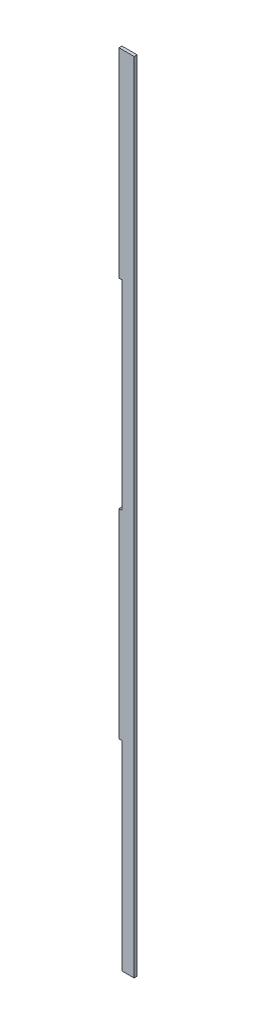
ISO-10303-21;
HEADER;
FILE_DESCRIPTION(('STEP AP214'),'2;1');
FILE_NAME('part.step','',(''),(''),'','','');
FILE_SCHEMA(('AUTOMOTIVE_DESIGN { 1 0 10303 214 1 1 1 1 }'));
ENDSEC;
DATA;
#1=APPLICATION_CONTEXT('core data for automotive mechanical design processes');
#2=APPLICATION_PROTOCOL_DEFINITION('international standard','automotive_design',2000,#1);
#3=PRODUCT_CONTEXT('',#1,'mechanical');
#4=PRODUCT('Part','Part','',(#3));
#5=PRODUCT_RELATED_PRODUCT_CATEGORY('part','',(#4));
#6=PRODUCT_DEFINITION_FORMATION('','',#4);
#7=PRODUCT_DEFINITION_CONTEXT('part definition',#1,'design');
#8=PRODUCT_DEFINITION('design','',#6,#7);
#9=PRODUCT_DEFINITION_SHAPE('','',#8);
#10=(LENGTH_UNIT() NAMED_UNIT(*) SI_UNIT(.MILLI.,.METRE.));
#11=(NAMED_UNIT(*) PLANE_ANGLE_UNIT() SI_UNIT($,.RADIAN.));
#12=(NAMED_UNIT(*) SI_UNIT($,.STERADIAN.) SOLID_ANGLE_UNIT());
#13=UNCERTAINTY_MEASURE_WITH_UNIT(LENGTH_MEASURE(1.E-05),#10,'distance_accuracy_value','');
#14=(GEOMETRIC_REPRESENTATION_CONTEXT(3) GLOBAL_UNCERTAINTY_ASSIGNED_CONTEXT((#13)) GLOBAL_UNIT_ASSIGNED_CONTEXT((#10,
#11,#12)) REPRESENTATION_CONTEXT('',''));
#15=CARTESIAN_POINT('',(0.,0.,0.));
#16=DIRECTION('',(0.,0.,1.));
#17=DIRECTION('',(1.,0.,0.));
#18=AXIS2_PLACEMENT_3D('',#15,#16,#17);
#19=CARTESIAN_POINT('',(-4.04375,427.1518,0.79375));
#20=DIRECTION('',(1.,0.,0.));
#21=DIRECTION('',(0.,0.,-1.));
#22=AXIS2_PLACEMENT_3D('',#19,#20,#21);
#23=PLANE('',#22);
#24=DIRECTION('',(0.,-1.,0.));
#25=VECTOR('',#24,1.);
#26=CARTESIAN_POINT('',(-4.04375,427.1518,0.79375));
#27=LINE('',#26,#25);
#28=CARTESIAN_POINT('',(-4.04375,213.5759,0.79375));
#29=VERTEX_POINT('',#28);
#30=CARTESIAN_POINT('',(-4.04374999999995,106.78795,0.79375));
#31=VERTEX_POINT('',#30);
#32=EDGE_CURVE('E135',#29,#31,#27,.T.);
#33=ORIENTED_EDGE('',*,*,#32,.F.);
#34=DIRECTION('',(0.,0.,1.));
#35=VECTOR('',#34,1.);
#36=CARTESIAN_POINT('',(-4.04375,213.5759,-426.35805));
#37=LINE('',#36,#35);
#38=CARTESIAN_POINT('',(-4.04375,213.5759,-0.793749999999982));
#39=VERTEX_POINT('',#38);
#40=EDGE_CURVE('E129',#39,#29,#37,.T.);
#41=ORIENTED_EDGE('',*,*,#40,.F.);
#42=DIRECTION('',(0.,-1.,0.));
#43=VECTOR('',#42,1.);
#44=CARTESIAN_POINT('',(-4.04375,427.1518,-0.79375));
#45=LINE('',#44,#43);
#46=CARTESIAN_POINT('',(-4.04374999999995,106.78795,-0.793749999999982));
#47=VERTEX_POINT('',#46);
#48=EDGE_CURVE('E134',#39,#47,#45,.T.);
#49=ORIENTED_EDGE('',*,*,#48,.T.);
#50=DIRECTION('',(0.,0.,1.));
#51=VECTOR('',#50,1.);
#52=CARTESIAN_POINT('',(-4.04374999999995,106.78795,-426.35805));
#53=LINE('',#52,#51);
#54=EDGE_CURVE('E289',#47,#31,#53,.T.);
#55=ORIENTED_EDGE('',*,*,#54,.T.);
#56=EDGE_LOOP('',(#33,#41,#49,#55));
#57=FACE_BOUND('',#56,.T.);
#58=ADVANCED_FACE('F33',(#57),#23,.F.);
#59=CARTESIAN_POINT('',(4.04375,427.1518,0.79375));
#60=DIRECTION('',(-1.,0.,0.));
#61=DIRECTION('',(0.,0.,1.));
#62=AXIS2_PLACEMENT_3D('',#59,#60,#61);
#63=PLANE('',#62);
#64=DIRECTION('',(0.,0.,-1.));
#65=VECTOR('',#64,1.);
#66=CARTESIAN_POINT('',(4.04375,0.,0.79375));
#67=LINE('',#66,#65);
#68=CARTESIAN_POINT('',(4.04375,0.,0.79375));
#69=VERTEX_POINT('',#68);
#70=CARTESIAN_POINT('',(4.04375,0.,-0.79375));
#71=VERTEX_POINT('',#70);
#72=EDGE_CURVE('E155',#69,#71,#67,.T.);
#73=ORIENTED_EDGE('',*,*,#72,.T.);
#74=DIRECTION('',(0.,-1.,0.));
#75=VECTOR('',#74,1.);
#76=CARTESIAN_POINT('',(4.04375,427.1518,-0.79375));
#77=LINE('',#76,#75);
#78=CARTESIAN_POINT('',(4.04375,427.1518,-0.79375));
#79=VERTEX_POINT('',#78);
#80=EDGE_CURVE('E41',#79,#71,#77,.T.);
#81=ORIENTED_EDGE('',*,*,#80,.F.);
#82=DIRECTION('',(0.,0.,-1.));
#83=VECTOR('',#82,1.);
#84=CARTESIAN_POINT('',(4.04375,427.1518,0.79375));
#85=LINE('',#84,#83);
#86=CARTESIAN_POINT('',(4.04375,427.1518,0.79375));
#87=VERTEX_POINT('',#86);
#88=EDGE_CURVE('E166',#87,#79,#85,.T.);
#89=ORIENTED_EDGE('',*,*,#88,.F.);
#90=DIRECTION('',(0.,-1.,0.));
#91=VECTOR('',#90,1.);
#92=CARTESIAN_POINT('',(4.04375,427.1518,0.79375));
#93=LINE('',#92,#91);
#94=EDGE_CURVE('E138',#87,#69,#93,.T.);
#95=ORIENTED_EDGE('',*,*,#94,.T.);
#96=EDGE_LOOP('',(#73,#81,#89,#95));
#97=FACE_BOUND('',#96,.T.);
#98=ADVANCED_FACE('F35',(#97),#63,.F.);
#99=CARTESIAN_POINT('',(-4.04375,427.1518,-0.79375));
#100=DIRECTION('',(0.,0.,1.));
#101=DIRECTION('',(1.,0.,0.));
#102=AXIS2_PLACEMENT_3D('',#99,#100,#101);
#103=PLANE('',#102);
#104=ORIENTED_EDGE('',*,*,#48,.F.);
#105=DIRECTION('',(1.,0.,0.));
#106=VECTOR('',#105,1.);
#107=CARTESIAN_POINT('',(-4.04375,213.5759,-0.79375));
#108=LINE('',#107,#106);
#109=CARTESIAN_POINT('',(-2.45624999999995,213.5759,-0.793749999999982));
#110=VERTEX_POINT('',#109);
#111=EDGE_CURVE('E281',#39,#110,#108,.T.);
#112=ORIENTED_EDGE('',*,*,#111,.T.);
#113=DIRECTION('',(0.,1.,0.));
#114=VECTOR('',#113,1.);
#115=CARTESIAN_POINT('',(-2.45624999999995,427.1518,-0.79375));
#116=LINE('',#115,#114);
#117=CARTESIAN_POINT('',(-2.45624999999995,320.36385,-0.793749999999982));
#118=VERTEX_POINT('',#117);
#119=EDGE_CURVE('E299',#110,#118,#116,.T.);
#120=ORIENTED_EDGE('',*,*,#119,.T.);
#121=DIRECTION('',(-1.,0.,0.));
#122=VECTOR('',#121,1.);
#123=CARTESIAN_POINT('',(-4.04375,320.36385,-0.79375));
#124=LINE('',#123,#122);
#125=CARTESIAN_POINT('',(-4.04374999999995,320.36385,-0.793749999999982));
#126=VERTEX_POINT('',#125);
#127=EDGE_CURVE('E303',#118,#126,#124,.T.);
#128=ORIENTED_EDGE('',*,*,#127,.T.);
#129=CARTESIAN_POINT('',(-4.04375,427.1518,-0.79375));
#130=VERTEX_POINT('',#129);
#131=EDGE_CURVE('E128',#130,#126,#45,.T.);
#132=ORIENTED_EDGE('',*,*,#131,.F.);
#133=DIRECTION('',(-1.,0.,0.));
#134=VECTOR('',#133,1.);
#135=CARTESIAN_POINT('',(-4.04375,427.1518,-0.79375));
#136=LINE('',#135,#134);
#137=EDGE_CURVE('E149',#79,#130,#136,.T.);
#138=ORIENTED_EDGE('',*,*,#137,.F.);
#139=ORIENTED_EDGE('',*,*,#80,.T.);
#140=DIRECTION('',(-1.,0.,0.));
#141=VECTOR('',#140,1.);
#142=CARTESIAN_POINT('',(-4.04375,0.,-0.79375));
#143=LINE('',#142,#141);
#144=CARTESIAN_POINT('',(-2.45624999999995,0.,-0.79375));
#145=VERTEX_POINT('',#144);
#146=EDGE_CURVE('E148',#71,#145,#143,.T.);
#147=ORIENTED_EDGE('',*,*,#146,.T.);
#148=DIRECTION('',(0.,1.,0.));
#149=VECTOR('',#148,1.);
#150=CARTESIAN_POINT('',(-2.45624999999995,427.1518,-0.79375));
#151=LINE('',#150,#149);
#152=CARTESIAN_POINT('',(-2.45624999999995,106.78795,-0.793749999999982));
#153=VERTEX_POINT('',#152);
#154=EDGE_CURVE('E55',#145,#153,#151,.T.);
#155=ORIENTED_EDGE('',*,*,#154,.T.);
#156=DIRECTION('',(-1.,0.,0.));
#157=VECTOR('',#156,1.);
#158=CARTESIAN_POINT('',(-4.04375,106.78795,-0.79375));
#159=LINE('',#158,#157);
#160=EDGE_CURVE('E158',#153,#47,#159,.T.);
#161=ORIENTED_EDGE('',*,*,#160,.T.);
#162=EDGE_LOOP('',(#104,#112,#120,#128,#132,#138,#139,#147,#155,#161));
#163=FACE_BOUND('',#162,.T.);
#164=ADVANCED_FACE('F147',(#163),#103,.F.);
#165=ORIENTED_EDGE('',*,*,#131,.T.);
#166=DIRECTION('',(0.,0.,1.));
#167=VECTOR('',#166,1.);
#168=CARTESIAN_POINT('',(-4.04374999999995,320.36385,-426.35805));
#169=LINE('',#168,#167);
#170=CARTESIAN_POINT('',(-4.04374999999995,320.36385,0.79375));
#171=VERTEX_POINT('',#170);
#172=EDGE_CURVE('E113',#126,#171,#169,.T.);
#173=ORIENTED_EDGE('',*,*,#172,.T.);
#174=CARTESIAN_POINT('',(-4.04375,427.1518,0.79375));
#175=VERTEX_POINT('',#174);
#176=EDGE_CURVE('E125',#175,#171,#27,.T.);
#177=ORIENTED_EDGE('',*,*,#176,.F.);
#178=DIRECTION('',(0.,0.,1.));
#179=VECTOR('',#178,1.);
#180=CARTESIAN_POINT('',(-4.04375,427.1518,0.79375));
#181=LINE('',#180,#179);
#182=EDGE_CURVE('E170',#130,#175,#181,.T.);
#183=ORIENTED_EDGE('',*,*,#182,.F.);
#184=EDGE_LOOP('',(#165,#173,#177,#183));
#185=FACE_BOUND('',#184,.T.);
#186=ADVANCED_FACE('F123',(#185),#23,.F.);
#187=CARTESIAN_POINT('',(-4.04375,427.1518,0.79375));
#188=DIRECTION('',(0.,0.,-1.));
#189=DIRECTION('',(-1.,0.,0.));
#190=AXIS2_PLACEMENT_3D('',#187,#188,#189);
#191=PLANE('',#190);
#192=DIRECTION('',(0.,1.,0.));
#193=VECTOR('',#192,1.);
#194=CARTESIAN_POINT('',(-2.45624999999995,213.5759,0.79375));
#195=LINE('',#194,#193);
#196=CARTESIAN_POINT('',(-2.45624999999995,213.5759,0.79375));
#197=VERTEX_POINT('',#196);
#198=CARTESIAN_POINT('',(-2.45624999999995,320.36385,0.79375));
#199=VERTEX_POINT('',#198);
#200=EDGE_CURVE('E48',#197,#199,#195,.T.);
#201=ORIENTED_EDGE('',*,*,#200,.F.);
#202=DIRECTION('',(1.,0.,0.));
#203=VECTOR('',#202,1.);
#204=CARTESIAN_POINT('',(-4.04375,213.5759,0.79375));
#205=LINE('',#204,#203);
#206=EDGE_CURVE('E118',#29,#197,#205,.T.);
#207=ORIENTED_EDGE('',*,*,#206,.F.);
#208=ORIENTED_EDGE('',*,*,#32,.T.);
#209=DIRECTION('',(-1.,0.,0.));
#210=VECTOR('',#209,1.);
#211=CARTESIAN_POINT('',(-4.04374999999995,106.78795,0.79375));
#212=LINE('',#211,#210);
#213=CARTESIAN_POINT('',(-2.45624999999995,106.78795,0.79375));
#214=VERTEX_POINT('',#213);
#215=EDGE_CURVE('E292',#214,#31,#212,.T.);
#216=ORIENTED_EDGE('',*,*,#215,.F.);
#217=DIRECTION('',(0.,1.,0.));
#218=VECTOR('',#217,1.);
#219=CARTESIAN_POINT('',(-2.45624999999995,0.,0.79375));
#220=LINE('',#219,#218);
#221=CARTESIAN_POINT('',(-2.45624999999995,0.,0.79375));
#222=VERTEX_POINT('',#221);
#223=EDGE_CURVE('E296',#222,#214,#220,.T.);
#224=ORIENTED_EDGE('',*,*,#223,.F.);
#225=DIRECTION('',(1.,0.,0.));
#226=VECTOR('',#225,1.);
#227=CARTESIAN_POINT('',(-4.04375,0.,0.79375));
#228=LINE('',#227,#226);
#229=EDGE_CURVE('E160',#222,#69,#228,.T.);
#230=ORIENTED_EDGE('',*,*,#229,.T.);
#231=ORIENTED_EDGE('',*,*,#94,.F.);
#232=DIRECTION('',(1.,0.,0.));
#233=VECTOR('',#232,1.);
#234=CARTESIAN_POINT('',(-4.04375,427.1518,0.79375));
#235=LINE('',#234,#233);
#236=EDGE_CURVE('E133',#175,#87,#235,.T.);
#237=ORIENTED_EDGE('',*,*,#236,.F.);
#238=ORIENTED_EDGE('',*,*,#176,.T.);
#239=DIRECTION('',(-1.,0.,0.));
#240=VECTOR('',#239,1.);
#241=CARTESIAN_POINT('',(-4.04374999999995,320.36385,0.79375));
#242=LINE('',#241,#240);
#243=EDGE_CURVE('E110',#199,#171,#242,.T.);
#244=ORIENTED_EDGE('',*,*,#243,.F.);
#245=EDGE_LOOP('',(#201,#207,#208,#216,#224,#230,#231,#237,#238,#244));
#246=FACE_BOUND('',#245,.T.);
#247=ADVANCED_FACE('F131',(#246),#191,.F.);
#248=CARTESIAN_POINT('',(0.,427.1518,0.));
#249=DIRECTION('',(0.,-1.,0.));
#250=DIRECTION('',(0.,0.,-1.));
#251=AXIS2_PLACEMENT_3D('',#248,#249,#250);
#252=PLANE('',#251);
#253=ORIENTED_EDGE('',*,*,#88,.T.);
#254=ORIENTED_EDGE('',*,*,#137,.T.);
#255=ORIENTED_EDGE('',*,*,#182,.T.);
#256=ORIENTED_EDGE('',*,*,#236,.T.);
#257=EDGE_LOOP('',(#253,#254,#255,#256));
#258=FACE_BOUND('',#257,.T.);
#259=ADVANCED_FACE('F173',(#258),#252,.F.);
#260=CARTESIAN_POINT('',(0.,0.,0.));
#261=DIRECTION('',(0.,-1.,0.));
#262=DIRECTION('',(0.,0.,-1.));
#263=AXIS2_PLACEMENT_3D('',#260,#261,#262);
#264=PLANE('',#263);
#265=DIRECTION('',(0.,0.,1.));
#266=VECTOR('',#265,1.);
#267=CARTESIAN_POINT('',(-2.45624999999995,0.,0.));
#268=LINE('',#267,#266);
#269=EDGE_CURVE('E11',#145,#222,#268,.T.);
#270=ORIENTED_EDGE('',*,*,#269,.F.);
#271=ORIENTED_EDGE('',*,*,#146,.F.);
#272=ORIENTED_EDGE('',*,*,#72,.F.);
#273=ORIENTED_EDGE('',*,*,#229,.F.);
#274=EDGE_LOOP('',(#270,#271,#272,#273));
#275=FACE_BOUND('',#274,.T.);
#276=ADVANCED_FACE('F175',(#275),#264,.T.);
#277=CARTESIAN_POINT('',(-4.04374999999995,106.78795,-426.35805));
#278=DIRECTION('',(0.,1.,0.));
#279=DIRECTION('',(0.,0.,1.));
#280=AXIS2_PLACEMENT_3D('',#277,#278,#279);
#281=PLANE('',#280);
#282=DIRECTION('',(0.,0.,1.));
#283=VECTOR('',#282,1.);
#284=CARTESIAN_POINT('',(-2.45624999999995,106.78795,-426.35805));
#285=LINE('',#284,#283);
#286=EDGE_CURVE('E290',#153,#214,#285,.T.);
#287=ORIENTED_EDGE('',*,*,#286,.T.);
#288=ORIENTED_EDGE('',*,*,#215,.T.);
#289=ORIENTED_EDGE('',*,*,#54,.F.);
#290=ORIENTED_EDGE('',*,*,#160,.F.);
#291=EDGE_LOOP('',(#287,#288,#289,#290));
#292=FACE_BOUND('',#291,.T.);
#293=ADVANCED_FACE('F181',(#292),#281,.F.);
#294=CARTESIAN_POINT('',(-2.45624999999995,0.,-426.35805));
#295=DIRECTION('',(1.,0.,0.));
#296=DIRECTION('',(0.,0.,-1.));
#297=AXIS2_PLACEMENT_3D('',#294,#295,#296);
#298=PLANE('',#297);
#299=ORIENTED_EDGE('',*,*,#269,.T.);
#300=ORIENTED_EDGE('',*,*,#223,.T.);
#301=ORIENTED_EDGE('',*,*,#286,.F.);
#302=ORIENTED_EDGE('',*,*,#154,.F.);
#303=EDGE_LOOP('',(#299,#300,#301,#302));
#304=FACE_BOUND('',#303,.T.);
#305=ADVANCED_FACE('F225',(#304),#298,.F.);
#306=CARTESIAN_POINT('',(-2.45624999999995,213.5759,-426.35805));
#307=DIRECTION('',(1.,0.,0.));
#308=DIRECTION('',(0.,0.,-1.));
#309=AXIS2_PLACEMENT_3D('',#306,#307,#308);
#310=PLANE('',#309);
#311=DIRECTION('',(0.,0.,1.));
#312=VECTOR('',#311,1.);
#313=CARTESIAN_POINT('',(-2.45624999999995,213.5759,-426.35805));
#314=LINE('',#313,#312);
#315=EDGE_CURVE('E282',#110,#197,#314,.T.);
#316=ORIENTED_EDGE('',*,*,#315,.T.);
#317=ORIENTED_EDGE('',*,*,#200,.T.);
#318=DIRECTION('',(0.,0.,1.));
#319=VECTOR('',#318,1.);
#320=CARTESIAN_POINT('',(-2.45624999999995,320.36385,-426.35805));
#321=LINE('',#320,#319);
#322=EDGE_CURVE('E115',#118,#199,#321,.T.);
#323=ORIENTED_EDGE('',*,*,#322,.F.);
#324=ORIENTED_EDGE('',*,*,#119,.F.);
#325=EDGE_LOOP('',(#316,#317,#323,#324));
#326=FACE_BOUND('',#325,.T.);
#327=ADVANCED_FACE('F234',(#326),#310,.F.);
#328=CARTESIAN_POINT('',(-4.04375,213.5759,-426.35805));
#329=DIRECTION('',(0.,-1.,0.));
#330=DIRECTION('',(0.,0.,-1.));
#331=AXIS2_PLACEMENT_3D('',#328,#329,#330);
#332=PLANE('',#331);
#333=ORIENTED_EDGE('',*,*,#40,.T.);
#334=ORIENTED_EDGE('',*,*,#206,.T.);
#335=ORIENTED_EDGE('',*,*,#315,.F.);
#336=ORIENTED_EDGE('',*,*,#111,.F.);
#337=EDGE_LOOP('',(#333,#334,#335,#336));
#338=FACE_BOUND('',#337,.T.);
#339=ADVANCED_FACE('F241',(#338),#332,.F.);
#340=CARTESIAN_POINT('',(-4.04374999999995,320.36385,-426.35805));
#341=DIRECTION('',(0.,1.,0.));
#342=DIRECTION('',(0.,0.,1.));
#343=AXIS2_PLACEMENT_3D('',#340,#341,#342);
#344=PLANE('',#343);
#345=ORIENTED_EDGE('',*,*,#322,.T.);
#346=ORIENTED_EDGE('',*,*,#243,.T.);
#347=ORIENTED_EDGE('',*,*,#172,.F.);
#348=ORIENTED_EDGE('',*,*,#127,.F.);
#349=EDGE_LOOP('',(#345,#346,#347,#348));
#350=FACE_BOUND('',#349,.T.);
#351=ADVANCED_FACE('F112',(#350),#344,.F.);
#352=CLOSED_SHELL('',(#58,#98,#164,#186,#247,#259,#276,#293,#305,#327,#339,#351));
#353=MANIFOLD_SOLID_BREP('B2',#352);
#354=ADVANCED_BREP_SHAPE_REPRESENTATION('',(#18,#353),#14);
#355=SHAPE_DEFINITION_REPRESENTATION(#9,#354);
ENDSEC;
END-ISO-10303-21;
